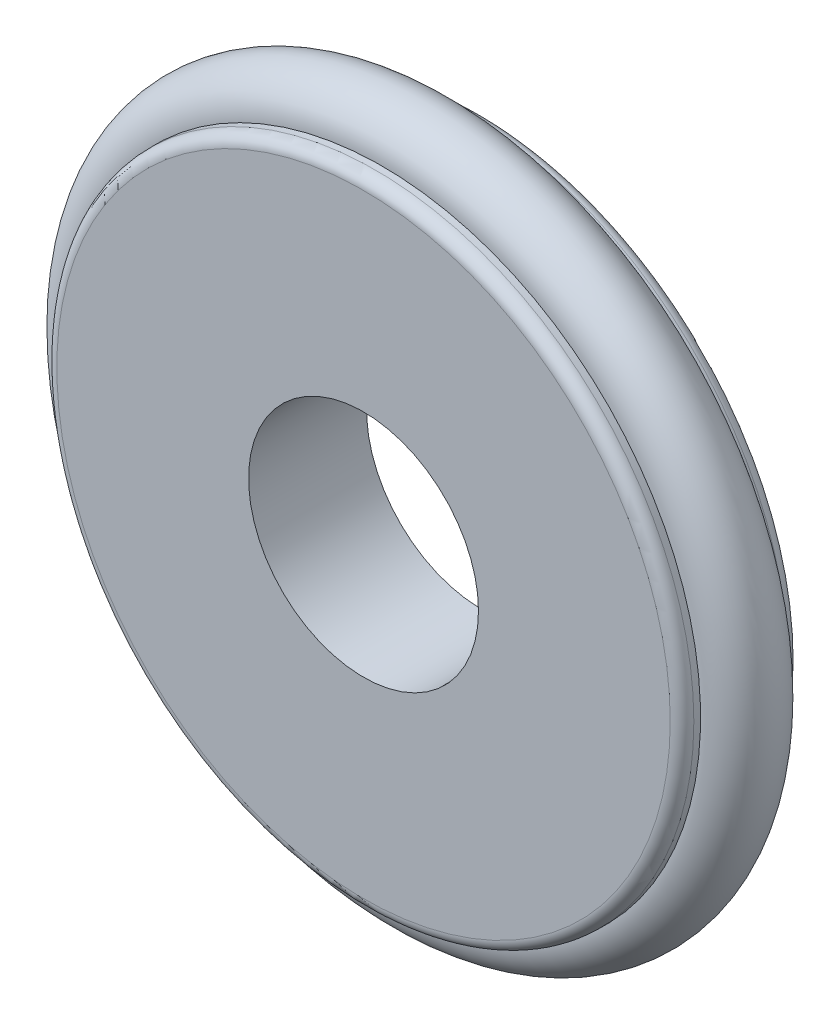
ISO-10303-21;
HEADER;
FILE_DESCRIPTION(('STEP AP214'),'2;1');
FILE_NAME('part.step','',(''),(''),'','','');
FILE_SCHEMA(('AUTOMOTIVE_DESIGN { 1 0 10303 214 1 1 1 1 }'));
ENDSEC;
DATA;
#1=APPLICATION_CONTEXT('core data for automotive mechanical design processes');
#2=APPLICATION_PROTOCOL_DEFINITION('international standard','automotive_design',2000,#1);
#3=PRODUCT_CONTEXT('',#1,'mechanical');
#4=PRODUCT('Part','Part','',(#3));
#5=PRODUCT_RELATED_PRODUCT_CATEGORY('part','',(#4));
#6=PRODUCT_DEFINITION_FORMATION('','',#4);
#7=PRODUCT_DEFINITION_CONTEXT('part definition',#1,'design');
#8=PRODUCT_DEFINITION('design','',#6,#7);
#9=PRODUCT_DEFINITION_SHAPE('','',#8);
#10=(LENGTH_UNIT() NAMED_UNIT(*) SI_UNIT(.MILLI.,.METRE.));
#11=(NAMED_UNIT(*) PLANE_ANGLE_UNIT() SI_UNIT($,.RADIAN.));
#12=(NAMED_UNIT(*) SI_UNIT($,.STERADIAN.) SOLID_ANGLE_UNIT());
#13=UNCERTAINTY_MEASURE_WITH_UNIT(LENGTH_MEASURE(1.E-05),#10,'distance_accuracy_value','');
#14=(GEOMETRIC_REPRESENTATION_CONTEXT(3) GLOBAL_UNCERTAINTY_ASSIGNED_CONTEXT((#13)) GLOBAL_UNIT_ASSIGNED_CONTEXT((#10,
#11,#12)) REPRESENTATION_CONTEXT('',''));
#15=CARTESIAN_POINT('',(0.,0.,0.));
#16=DIRECTION('',(0.,0.,1.));
#17=DIRECTION('',(1.,0.,0.));
#18=AXIS2_PLACEMENT_3D('',#15,#16,#17);
#19=CARTESIAN_POINT('',(0.,0.,5.22314634771185));
#20=DIRECTION('',(0.,0.,-1.));
#21=DIRECTION('',(-1.,0.,0.));
#22=AXIS2_PLACEMENT_3D('',#19,#20,#21);
#23=TOROIDAL_SURFACE('',#22,27.1035281408727,3.19541686335897);
#24=CARTESIAN_POINT('',(-30.2989450042317,0.,5.22314634771185));
#25=VERTEX_POINT('',#24);
#26=VERTEX_LOOP('',#25);
#27=FACE_BOUND('',#26,.T.);
#28=ADVANCED_FACE('F39',(#27),#23,.T.);
#29=CLOSED_SHELL('',(#28));
#30=MANIFOLD_SOLID_BREP('B2',#29);
#31=CARTESIAN_POINT('',(0.,0.,10.));
#32=DIRECTION('',(0.,0.,-1.));
#33=DIRECTION('',(-1.,0.,0.));
#34=AXIS2_PLACEMENT_3D('',#31,#32,#33);
#35=CYLINDRICAL_SURFACE('',#34,27.);
#36=CARTESIAN_POINT('',(0.,0.,0.999999999999999));
#37=DIRECTION('',(0.,0.,1.));
#38=DIRECTION('',(1.,0.,0.));
#39=AXIS2_PLACEMENT_3D('',#36,#37,#38);
#40=CIRCLE('',#39,27.);
#41=CARTESIAN_POINT('',(27.,0.,0.999999999999999));
#42=VERTEX_POINT('',#41);
#43=EDGE_CURVE('E66',#42,#42,#40,.T.);
#44=ORIENTED_EDGE('',*,*,#43,.T.);
#45=EDGE_LOOP('',(#44));
#46=FACE_BOUND('',#45,.T.);
#47=CARTESIAN_POINT('',(0.,0.,2.01150295434945));
#48=DIRECTION('',(0.,0.,1.));
#49=DIRECTION('',(1.,0.,0.));
#50=AXIS2_PLACEMENT_3D('',#47,#48,#49);
#51=CIRCLE('',#50,27.);
#52=CARTESIAN_POINT('',(27.,0.,2.01150295434945));
#53=VERTEX_POINT('',#52);
#54=EDGE_CURVE('E72',#53,#53,#51,.F.);
#55=ORIENTED_EDGE('',*,*,#54,.T.);
#56=EDGE_LOOP('',(#55));
#57=FACE_BOUND('',#56,.T.);
#58=ADVANCED_FACE('F51',(#46,#57),#35,.T.);
#59=CARTESIAN_POINT('',(0.,0.,9.));
#60=DIRECTION('',(0.,0.,1.));
#61=DIRECTION('',(1.,0.,0.));
#62=AXIS2_PLACEMENT_3D('',#59,#60,#61);
#63=CIRCLE('',#62,27.);
#64=CARTESIAN_POINT('',(27.,0.,9.));
#65=VERTEX_POINT('',#64);
#66=EDGE_CURVE('E38',#65,#65,#63,.F.);
#67=ORIENTED_EDGE('',*,*,#66,.T.);
#68=EDGE_LOOP('',(#67));
#69=FACE_BOUND('',#68,.T.);
#70=CARTESIAN_POINT('',(0.,0.,8.42917618961756));
#71=DIRECTION('',(0.,0.,-1.));
#72=DIRECTION('',(-1.,0.,0.));
#73=AXIS2_PLACEMENT_3D('',#70,#71,#72);
#74=CIRCLE('',#73,27.);
#75=CARTESIAN_POINT('',(-27.,0.,8.42917618961756));
#76=VERTEX_POINT('',#75);
#77=EDGE_CURVE('E76',#76,#76,#74,.F.);
#78=ORIENTED_EDGE('',*,*,#77,.T.);
#79=EDGE_LOOP('',(#78));
#80=FACE_BOUND('',#79,.T.);
#81=ADVANCED_FACE('F95',(#69,#80),#35,.T.);
#82=CARTESIAN_POINT('',(0.,0.,10.));
#83=DIRECTION('',(0.,0.,1.));
#84=DIRECTION('',(1.,0.,0.));
#85=AXIS2_PLACEMENT_3D('',#82,#83,#84);
#86=PLANE('',#85);
#87=CARTESIAN_POINT('',(0.,0.,10.));
#88=DIRECTION('',(0.,0.,1.));
#89=DIRECTION('',(1.,0.,0.));
#90=AXIS2_PLACEMENT_3D('',#87,#88,#89);
#91=CIRCLE('',#90,26.);
#92=CARTESIAN_POINT('',(26.,0.,10.));
#93=VERTEX_POINT('',#92);
#94=EDGE_CURVE('E58',#93,#93,#91,.T.);
#95=ORIENTED_EDGE('',*,*,#94,.T.);
#96=EDGE_LOOP('',(#95));
#97=FACE_BOUND('',#96,.T.);
#98=CARTESIAN_POINT('',(0.,0.,10.));
#99=DIRECTION('',(0.,0.,1.));
#100=DIRECTION('',(1.,0.,0.));
#101=AXIS2_PLACEMENT_3D('',#98,#99,#100);
#102=CIRCLE('',#101,9.74437386225119);
#103=CARTESIAN_POINT('',(9.74437386225119,0.,10.));
#104=VERTEX_POINT('',#103);
#105=EDGE_CURVE('E75',#104,#104,#102,.T.);
#106=ORIENTED_EDGE('',*,*,#105,.F.);
#107=EDGE_LOOP('',(#106));
#108=FACE_BOUND('',#107,.T.);
#109=ADVANCED_FACE('F93',(#97,#108),#86,.T.);
#110=CARTESIAN_POINT('',(0.,0.,0.));
#111=DIRECTION('',(0.,0.,1.));
#112=DIRECTION('',(1.,0.,0.));
#113=AXIS2_PLACEMENT_3D('',#110,#111,#112);
#114=PLANE('',#113);
#115=CARTESIAN_POINT('',(0.,0.,0.));
#116=DIRECTION('',(0.,0.,1.));
#117=DIRECTION('',(1.,0.,0.));
#118=AXIS2_PLACEMENT_3D('',#115,#116,#117);
#119=CIRCLE('',#118,26.);
#120=CARTESIAN_POINT('',(26.,0.,0.));
#121=VERTEX_POINT('',#120);
#122=EDGE_CURVE('E62',#121,#121,#119,.F.);
#123=ORIENTED_EDGE('',*,*,#122,.T.);
#124=EDGE_LOOP('',(#123));
#125=FACE_BOUND('',#124,.T.);
#126=CARTESIAN_POINT('',(0.,0.,0.));
#127=DIRECTION('',(0.,0.,1.));
#128=DIRECTION('',(1.,0.,0.));
#129=AXIS2_PLACEMENT_3D('',#126,#127,#128);
#130=CIRCLE('',#129,9.74437386225119);
#131=CARTESIAN_POINT('',(9.74437386225119,0.,0.));
#132=VERTEX_POINT('',#131);
#133=EDGE_CURVE('E71',#132,#132,#130,.T.);
#134=ORIENTED_EDGE('',*,*,#133,.T.);
#135=EDGE_LOOP('',(#134));
#136=FACE_BOUND('',#135,.T.);
#137=ADVANCED_FACE('F84',(#125,#136),#114,.F.);
#138=CARTESIAN_POINT('',(0.,0.,0.));
#139=DIRECTION('',(0.,0.,1.));
#140=DIRECTION('',(1.,0.,0.));
#141=AXIS2_PLACEMENT_3D('',#138,#139,#140);
#142=CYLINDRICAL_SURFACE('',#141,9.74437386225119);
#143=ORIENTED_EDGE('',*,*,#133,.F.);
#144=EDGE_LOOP('',(#143));
#145=FACE_BOUND('',#144,.T.);
#146=ORIENTED_EDGE('',*,*,#105,.T.);
#147=EDGE_LOOP('',(#146));
#148=FACE_BOUND('',#147,.T.);
#149=ADVANCED_FACE('F86',(#145,#148),#142,.F.);
#150=CARTESIAN_POINT('',(0.,0.,5.22033957198351));
#151=DIRECTION('',(0.,0.,-1.));
#152=DIRECTION('',(-1.,0.,0.));
#153=AXIS2_PLACEMENT_3D('',#150,#151,#152);
#154=TOROIDAL_SURFACE('',#153,26.9837450407603,3.20887778863095);
#155=ORIENTED_EDGE('',*,*,#77,.F.);
#156=EDGE_LOOP('',(#155));
#157=FACE_BOUND('',#156,.T.);
#158=ORIENTED_EDGE('',*,*,#54,.F.);
#159=EDGE_LOOP('',(#158));
#160=FACE_BOUND('',#159,.T.);
#161=ADVANCED_FACE('F89',(#157,#160),#154,.F.);
#162=CARTESIAN_POINT('',(0.,0.,0.999999999999999));
#163=DIRECTION('',(0.,0.,1.));
#164=DIRECTION('',(1.,0.,0.));
#165=AXIS2_PLACEMENT_3D('',#162,#163,#164);
#166=TOROIDAL_SURFACE('',#165,26.,1.);
#167=ORIENTED_EDGE('',*,*,#122,.F.);
#168=EDGE_LOOP('',(#167));
#169=FACE_BOUND('',#168,.T.);
#170=ORIENTED_EDGE('',*,*,#43,.F.);
#171=EDGE_LOOP('',(#170));
#172=FACE_BOUND('',#171,.T.);
#173=ADVANCED_FACE('F110',(#169,#172),#166,.T.);
#174=CARTESIAN_POINT('',(0.,0.,9.));
#175=DIRECTION('',(0.,0.,1.));
#176=DIRECTION('',(1.,0.,0.));
#177=AXIS2_PLACEMENT_3D('',#174,#175,#176);
#178=TOROIDAL_SURFACE('',#177,26.,1.);
#179=ORIENTED_EDGE('',*,*,#66,.F.);
#180=EDGE_LOOP('',(#179));
#181=FACE_BOUND('',#180,.T.);
#182=ORIENTED_EDGE('',*,*,#94,.F.);
#183=EDGE_LOOP('',(#182));
#184=FACE_BOUND('',#183,.T.);
#185=ADVANCED_FACE('F53',(#181,#184),#178,.T.);
#186=CLOSED_SHELL('',(#58,#81,#109,#137,#149,#161,#173,#185));
#187=MANIFOLD_SOLID_BREP('B6',#186);
#188=ADVANCED_BREP_SHAPE_REPRESENTATION('',(#18,#30,#187),#14);
#189=SHAPE_DEFINITION_REPRESENTATION(#9,#188);
ENDSEC;
END-ISO-10303-21;
